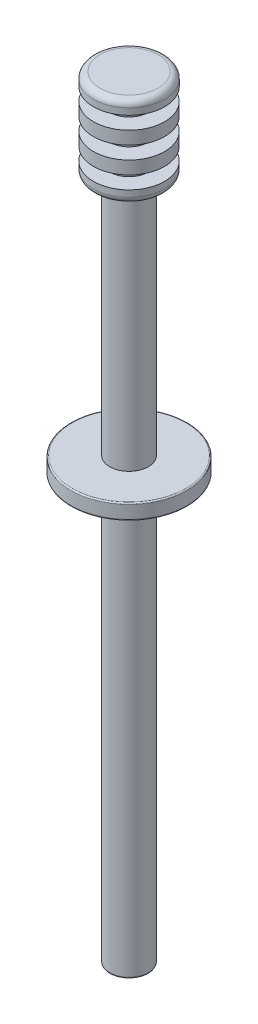
ISO-10303-21;
HEADER;
FILE_DESCRIPTION(('STEP AP214'),'2;1');
FILE_NAME('part.step','',(''),(''),'','','');
FILE_SCHEMA(('AUTOMOTIVE_DESIGN { 1 0 10303 214 1 1 1 1 }'));
ENDSEC;
DATA;
#1=APPLICATION_CONTEXT('core data for automotive mechanical design processes');
#2=APPLICATION_PROTOCOL_DEFINITION('international standard','automotive_design',2000,#1);
#3=PRODUCT_CONTEXT('',#1,'mechanical');
#4=PRODUCT('Part','Part','',(#3));
#5=PRODUCT_RELATED_PRODUCT_CATEGORY('part','',(#4));
#6=PRODUCT_DEFINITION_FORMATION('','',#4);
#7=PRODUCT_DEFINITION_CONTEXT('part definition',#1,'design');
#8=PRODUCT_DEFINITION('design','',#6,#7);
#9=PRODUCT_DEFINITION_SHAPE('','',#8);
#10=(LENGTH_UNIT() NAMED_UNIT(*) SI_UNIT(.MILLI.,.METRE.));
#11=(NAMED_UNIT(*) PLANE_ANGLE_UNIT() SI_UNIT($,.RADIAN.));
#12=(NAMED_UNIT(*) SI_UNIT($,.STERADIAN.) SOLID_ANGLE_UNIT());
#13=UNCERTAINTY_MEASURE_WITH_UNIT(LENGTH_MEASURE(1.E-05),#10,'distance_accuracy_value','');
#14=(GEOMETRIC_REPRESENTATION_CONTEXT(3) GLOBAL_UNCERTAINTY_ASSIGNED_CONTEXT((#13)) GLOBAL_UNIT_ASSIGNED_CONTEXT((#10,
#11,#12)) REPRESENTATION_CONTEXT('',''));
#15=CARTESIAN_POINT('',(0.,0.,0.));
#16=DIRECTION('',(0.,0.,1.));
#17=DIRECTION('',(1.,0.,0.));
#18=AXIS2_PLACEMENT_3D('',#15,#16,#17);
#19=CARTESIAN_POINT('',(0.,1.,0.));
#20=DIRECTION('',(0.,-1.,0.));
#21=DIRECTION('',(0.,0.,-1.));
#22=AXIS2_PLACEMENT_3D('',#19,#20,#21);
#23=CYLINDRICAL_SURFACE('',#22,2.75);
#24=CARTESIAN_POINT('',(0.,0.5,0.));
#25=DIRECTION('',(0.,1.,0.));
#26=DIRECTION('',(0.,0.,1.));
#27=AXIS2_PLACEMENT_3D('',#24,#25,#26);
#28=CIRCLE('',#27,2.75);
#29=CARTESIAN_POINT('',(0.,0.5,2.75));
#30=VERTEX_POINT('',#29);
#31=EDGE_CURVE('E80',#30,#30,#28,.F.);
#32=ORIENTED_EDGE('',*,*,#31,.T.);
#33=EDGE_LOOP('',(#32));
#34=FACE_BOUND('',#33,.T.);
#35=CARTESIAN_POINT('',(0.,0.,0.));
#36=DIRECTION('',(0.,1.,0.));
#37=DIRECTION('',(0.,0.,1.));
#38=AXIS2_PLACEMENT_3D('',#35,#36,#37);
#39=CIRCLE('',#38,2.75);
#40=CARTESIAN_POINT('',(0.,0.,2.75));
#41=VERTEX_POINT('',#40);
#42=EDGE_CURVE('E89',#41,#41,#39,.T.);
#43=ORIENTED_EDGE('',*,*,#42,.T.);
#44=EDGE_LOOP('',(#43));
#45=FACE_BOUND('',#44,.T.);
#46=ADVANCED_FACE('F40',(#34,#45),#23,.T.);
#47=CARTESIAN_POINT('',(0.,1.,0.));
#48=DIRECTION('',(0.,1.,0.));
#49=DIRECTION('',(0.,0.,1.));
#50=AXIS2_PLACEMENT_3D('',#47,#48,#49);
#51=PLANE('',#50);
#52=CARTESIAN_POINT('',(0.,1.,0.));
#53=DIRECTION('',(0.,1.,0.));
#54=DIRECTION('',(0.,0.,1.));
#55=AXIS2_PLACEMENT_3D('',#52,#53,#54);
#56=CIRCLE('',#55,2.25);
#57=CARTESIAN_POINT('',(0.,1.,2.25));
#58=VERTEX_POINT('',#57);
#59=EDGE_CURVE('E84',#58,#58,#56,.T.);
#60=ORIENTED_EDGE('',*,*,#59,.T.);
#61=EDGE_LOOP('',(#60));
#62=FACE_BOUND('',#61,.T.);
#63=ADVANCED_FACE('F168',(#62),#51,.T.);
#64=CARTESIAN_POINT('',(0.,0.,0.));
#65=DIRECTION('',(0.,1.,0.));
#66=DIRECTION('',(0.,0.,1.));
#67=AXIS2_PLACEMENT_3D('',#64,#65,#66);
#68=PLANE('',#67);
#69=CARTESIAN_POINT('',(0.,0.,0.));
#70=DIRECTION('',(0.,-1.,0.));
#71=DIRECTION('',(0.,0.,-1.));
#72=AXIS2_PLACEMENT_3D('',#69,#70,#71);
#73=CIRCLE('',#72,1.5);
#74=CARTESIAN_POINT('',(0.,0.,-1.5));
#75=VERTEX_POINT('',#74);
#76=EDGE_CURVE('E93',#75,#75,#73,.T.);
#77=ORIENTED_EDGE('',*,*,#76,.F.);
#78=EDGE_LOOP('',(#77));
#79=FACE_BOUND('',#78,.T.);
#80=ORIENTED_EDGE('',*,*,#42,.F.);
#81=EDGE_LOOP('',(#80));
#82=FACE_BOUND('',#81,.T.);
#83=ADVANCED_FACE('F174',(#79,#82),#68,.F.);
#84=CARTESIAN_POINT('',(0.,-1.,0.));
#85=DIRECTION('',(0.,1.,0.));
#86=DIRECTION('',(0.,0.,1.));
#87=AXIS2_PLACEMENT_3D('',#84,#85,#86);
#88=CYLINDRICAL_SURFACE('',#87,1.5);
#89=CARTESIAN_POINT('',(0.,-1.,0.));
#90=DIRECTION('',(0.,-1.,0.));
#91=DIRECTION('',(0.,0.,-1.));
#92=AXIS2_PLACEMENT_3D('',#89,#90,#91);
#93=CIRCLE('',#92,1.5);
#94=CARTESIAN_POINT('',(0.,-1.,-1.5));
#95=VERTEX_POINT('',#94);
#96=EDGE_CURVE('E94',#95,#95,#93,.T.);
#97=ORIENTED_EDGE('',*,*,#96,.F.);
#98=EDGE_LOOP('',(#97));
#99=FACE_BOUND('',#98,.T.);
#100=ORIENTED_EDGE('',*,*,#76,.T.);
#101=EDGE_LOOP('',(#100));
#102=FACE_BOUND('',#101,.T.);
#103=ADVANCED_FACE('F255',(#99,#102),#88,.T.);
#104=CARTESIAN_POINT('',(0.,-2.,0.));
#105=DIRECTION('',(0.,1.,0.));
#106=DIRECTION('',(0.,0.,1.));
#107=AXIS2_PLACEMENT_3D('',#104,#105,#106);
#108=CYLINDRICAL_SURFACE('',#107,2.75);
#109=CARTESIAN_POINT('',(0.,-2.,0.));
#110=DIRECTION('',(0.,-1.,0.));
#111=DIRECTION('',(0.,0.,-1.));
#112=AXIS2_PLACEMENT_3D('',#109,#110,#111);
#113=CIRCLE('',#112,2.75);
#114=CARTESIAN_POINT('',(0.,-2.,-2.75));
#115=VERTEX_POINT('',#114);
#116=EDGE_CURVE('E102',#115,#115,#113,.T.);
#117=ORIENTED_EDGE('',*,*,#116,.F.);
#118=EDGE_LOOP('',(#117));
#119=FACE_BOUND('',#118,.T.);
#120=CARTESIAN_POINT('',(0.,-1.,0.));
#121=DIRECTION('',(0.,-1.,0.));
#122=DIRECTION('',(0.,0.,-1.));
#123=AXIS2_PLACEMENT_3D('',#120,#121,#122);
#124=CIRCLE('',#123,2.75);
#125=CARTESIAN_POINT('',(0.,-1.,-2.75));
#126=VERTEX_POINT('',#125);
#127=EDGE_CURVE('E103',#126,#126,#124,.T.);
#128=ORIENTED_EDGE('',*,*,#127,.T.);
#129=EDGE_LOOP('',(#128));
#130=FACE_BOUND('',#129,.T.);
#131=ADVANCED_FACE('F248',(#119,#130),#108,.T.);
#132=CARTESIAN_POINT('',(0.,-2.,0.));
#133=DIRECTION('',(0.,-1.,0.));
#134=DIRECTION('',(0.,0.,-1.));
#135=AXIS2_PLACEMENT_3D('',#132,#133,#134);
#136=PLANE('',#135);
#137=CARTESIAN_POINT('',(0.,-2.,0.));
#138=DIRECTION('',(0.,-1.,0.));
#139=DIRECTION('',(0.,0.,-1.));
#140=AXIS2_PLACEMENT_3D('',#137,#138,#139);
#141=CIRCLE('',#140,1.5);
#142=CARTESIAN_POINT('',(0.,-2.,-1.5));
#143=VERTEX_POINT('',#142);
#144=EDGE_CURVE('E98',#143,#143,#141,.T.);
#145=ORIENTED_EDGE('',*,*,#144,.F.);
#146=EDGE_LOOP('',(#145));
#147=FACE_BOUND('',#146,.T.);
#148=ORIENTED_EDGE('',*,*,#116,.T.);
#149=EDGE_LOOP('',(#148));
#150=FACE_BOUND('',#149,.T.);
#151=ADVANCED_FACE('F245',(#147,#150),#136,.T.);
#152=CARTESIAN_POINT('',(0.,-1.,0.));
#153=DIRECTION('',(0.,-1.,0.));
#154=DIRECTION('',(0.,0.,-1.));
#155=AXIS2_PLACEMENT_3D('',#152,#153,#154);
#156=PLANE('',#155);
#157=ORIENTED_EDGE('',*,*,#96,.T.);
#158=EDGE_LOOP('',(#157));
#159=FACE_BOUND('',#158,.T.);
#160=ORIENTED_EDGE('',*,*,#127,.F.);
#161=EDGE_LOOP('',(#160));
#162=FACE_BOUND('',#161,.T.);
#163=ADVANCED_FACE('F243',(#159,#162),#156,.F.);
#164=CARTESIAN_POINT('',(0.,-3.,0.));
#165=DIRECTION('',(0.,1.,0.));
#166=DIRECTION('',(0.,0.,1.));
#167=AXIS2_PLACEMENT_3D('',#164,#165,#166);
#168=CYLINDRICAL_SURFACE('',#167,1.5);
#169=CARTESIAN_POINT('',(0.,-3.,0.));
#170=DIRECTION('',(0.,-1.,0.));
#171=DIRECTION('',(0.,0.,-1.));
#172=AXIS2_PLACEMENT_3D('',#169,#170,#171);
#173=CIRCLE('',#172,1.5);
#174=CARTESIAN_POINT('',(0.,-3.,-1.5));
#175=VERTEX_POINT('',#174);
#176=EDGE_CURVE('E107',#175,#175,#173,.T.);
#177=ORIENTED_EDGE('',*,*,#176,.F.);
#178=EDGE_LOOP('',(#177));
#179=FACE_BOUND('',#178,.T.);
#180=ORIENTED_EDGE('',*,*,#144,.T.);
#181=EDGE_LOOP('',(#180));
#182=FACE_BOUND('',#181,.T.);
#183=ADVANCED_FACE('F239',(#179,#182),#168,.T.);
#184=CARTESIAN_POINT('',(0.,-4.,0.));
#185=DIRECTION('',(0.,1.,0.));
#186=DIRECTION('',(0.,0.,1.));
#187=AXIS2_PLACEMENT_3D('',#184,#185,#186);
#188=CYLINDRICAL_SURFACE('',#187,2.75);
#189=CARTESIAN_POINT('',(0.,-4.,0.));
#190=DIRECTION('',(0.,-1.,0.));
#191=DIRECTION('',(0.,0.,-1.));
#192=AXIS2_PLACEMENT_3D('',#189,#190,#191);
#193=CIRCLE('',#192,2.75);
#194=CARTESIAN_POINT('',(0.,-4.,-2.75));
#195=VERTEX_POINT('',#194);
#196=EDGE_CURVE('E118',#195,#195,#193,.T.);
#197=ORIENTED_EDGE('',*,*,#196,.F.);
#198=EDGE_LOOP('',(#197));
#199=FACE_BOUND('',#198,.T.);
#200=CARTESIAN_POINT('',(0.,-3.,0.));
#201=DIRECTION('',(0.,-1.,0.));
#202=DIRECTION('',(0.,0.,-1.));
#203=AXIS2_PLACEMENT_3D('',#200,#201,#202);
#204=CIRCLE('',#203,2.75);
#205=CARTESIAN_POINT('',(0.,-3.,-2.75));
#206=VERTEX_POINT('',#205);
#207=EDGE_CURVE('E119',#206,#206,#204,.T.);
#208=ORIENTED_EDGE('',*,*,#207,.T.);
#209=EDGE_LOOP('',(#208));
#210=FACE_BOUND('',#209,.T.);
#211=ADVANCED_FACE('F232',(#199,#210),#188,.T.);
#212=CARTESIAN_POINT('',(0.,-4.,0.));
#213=DIRECTION('',(0.,-1.,0.));
#214=DIRECTION('',(0.,0.,-1.));
#215=AXIS2_PLACEMENT_3D('',#212,#213,#214);
#216=PLANE('',#215);
#217=CARTESIAN_POINT('',(0.,-4.,0.));
#218=DIRECTION('',(0.,-1.,0.));
#219=DIRECTION('',(0.,0.,-1.));
#220=AXIS2_PLACEMENT_3D('',#217,#218,#219);
#221=CIRCLE('',#220,1.5);
#222=CARTESIAN_POINT('',(0.,-4.,-1.5));
#223=VERTEX_POINT('',#222);
#224=EDGE_CURVE('E114',#223,#223,#221,.T.);
#225=ORIENTED_EDGE('',*,*,#224,.F.);
#226=EDGE_LOOP('',(#225));
#227=FACE_BOUND('',#226,.T.);
#228=ORIENTED_EDGE('',*,*,#196,.T.);
#229=EDGE_LOOP('',(#228));
#230=FACE_BOUND('',#229,.T.);
#231=ADVANCED_FACE('F229',(#227,#230),#216,.T.);
#232=CARTESIAN_POINT('',(0.,-3.,0.));
#233=DIRECTION('',(0.,-1.,0.));
#234=DIRECTION('',(0.,0.,-1.));
#235=AXIS2_PLACEMENT_3D('',#232,#233,#234);
#236=PLANE('',#235);
#237=ORIENTED_EDGE('',*,*,#176,.T.);
#238=EDGE_LOOP('',(#237));
#239=FACE_BOUND('',#238,.T.);
#240=ORIENTED_EDGE('',*,*,#207,.F.);
#241=EDGE_LOOP('',(#240));
#242=FACE_BOUND('',#241,.T.);
#243=ADVANCED_FACE('F227',(#239,#242),#236,.F.);
#244=CARTESIAN_POINT('',(0.,-5.,0.));
#245=DIRECTION('',(0.,1.,0.));
#246=DIRECTION('',(0.,0.,1.));
#247=AXIS2_PLACEMENT_3D('',#244,#245,#246);
#248=CYLINDRICAL_SURFACE('',#247,1.5);
#249=CARTESIAN_POINT('',(0.,-5.,0.));
#250=DIRECTION('',(0.,-1.,0.));
#251=DIRECTION('',(0.,0.,-1.));
#252=AXIS2_PLACEMENT_3D('',#249,#250,#251);
#253=CIRCLE('',#252,1.5);
#254=CARTESIAN_POINT('',(0.,-5.,-1.5));
#255=VERTEX_POINT('',#254);
#256=EDGE_CURVE('E123',#255,#255,#253,.T.);
#257=ORIENTED_EDGE('',*,*,#256,.F.);
#258=EDGE_LOOP('',(#257));
#259=FACE_BOUND('',#258,.T.);
#260=ORIENTED_EDGE('',*,*,#224,.T.);
#261=EDGE_LOOP('',(#260));
#262=FACE_BOUND('',#261,.T.);
#263=ADVANCED_FACE('F223',(#259,#262),#248,.T.);
#264=CARTESIAN_POINT('',(0.,-6.,0.));
#265=DIRECTION('',(0.,1.,0.));
#266=DIRECTION('',(0.,0.,1.));
#267=AXIS2_PLACEMENT_3D('',#264,#265,#266);
#268=CYLINDRICAL_SURFACE('',#267,2.75);
#269=CARTESIAN_POINT('',(0.,-5.5,0.));
#270=DIRECTION('',(0.,-1.,0.));
#271=DIRECTION('',(0.,0.,-1.));
#272=AXIS2_PLACEMENT_3D('',#269,#270,#271);
#273=CIRCLE('',#272,2.75);
#274=CARTESIAN_POINT('',(0.,-5.5,-2.75));
#275=VERTEX_POINT('',#274);
#276=EDGE_CURVE('E53',#275,#275,#273,.F.);
#277=ORIENTED_EDGE('',*,*,#276,.T.);
#278=EDGE_LOOP('',(#277));
#279=FACE_BOUND('',#278,.T.);
#280=CARTESIAN_POINT('',(0.,-5.,0.));
#281=DIRECTION('',(0.,-1.,0.));
#282=DIRECTION('',(0.,0.,-1.));
#283=AXIS2_PLACEMENT_3D('',#280,#281,#282);
#284=CIRCLE('',#283,2.75);
#285=CARTESIAN_POINT('',(0.,-5.,-2.75));
#286=VERTEX_POINT('',#285);
#287=EDGE_CURVE('E134',#286,#286,#284,.T.);
#288=ORIENTED_EDGE('',*,*,#287,.T.);
#289=EDGE_LOOP('',(#288));
#290=FACE_BOUND('',#289,.T.);
#291=ADVANCED_FACE('F207',(#279,#290),#268,.T.);
#292=CARTESIAN_POINT('',(0.,-6.,0.));
#293=DIRECTION('',(0.,-1.,0.));
#294=DIRECTION('',(0.,0.,-1.));
#295=AXIS2_PLACEMENT_3D('',#292,#293,#294);
#296=PLANE('',#295);
#297=CARTESIAN_POINT('',(0.,-6.,0.));
#298=DIRECTION('',(0.,-1.,0.));
#299=DIRECTION('',(0.,0.,-1.));
#300=AXIS2_PLACEMENT_3D('',#297,#298,#299);
#301=CIRCLE('',#300,2.25);
#302=CARTESIAN_POINT('',(0.,-6.,-2.25));
#303=VERTEX_POINT('',#302);
#304=EDGE_CURVE('E58',#303,#303,#301,.T.);
#305=ORIENTED_EDGE('',*,*,#304,.T.);
#306=EDGE_LOOP('',(#305));
#307=FACE_BOUND('',#306,.T.);
#308=CARTESIAN_POINT('',(0.,-6.,0.));
#309=DIRECTION('',(0.,-1.,0.));
#310=DIRECTION('',(0.,0.,-1.));
#311=AXIS2_PLACEMENT_3D('',#308,#309,#310);
#312=CIRCLE('',#311,1.5);
#313=CARTESIAN_POINT('',(0.,-6.,-1.5));
#314=VERTEX_POINT('',#313);
#315=EDGE_CURVE('E130',#314,#314,#312,.T.);
#316=ORIENTED_EDGE('',*,*,#315,.F.);
#317=EDGE_LOOP('',(#316));
#318=FACE_BOUND('',#317,.T.);
#319=ADVANCED_FACE('F203',(#307,#318),#296,.T.);
#320=CARTESIAN_POINT('',(0.,-5.,0.));
#321=DIRECTION('',(0.,-1.,0.));
#322=DIRECTION('',(0.,0.,-1.));
#323=AXIS2_PLACEMENT_3D('',#320,#321,#322);
#324=PLANE('',#323);
#325=ORIENTED_EDGE('',*,*,#256,.T.);
#326=EDGE_LOOP('',(#325));
#327=FACE_BOUND('',#326,.T.);
#328=ORIENTED_EDGE('',*,*,#287,.F.);
#329=EDGE_LOOP('',(#328));
#330=FACE_BOUND('',#329,.T.);
#331=ADVANCED_FACE('F206',(#327,#330),#324,.F.);
#332=CARTESIAN_POINT('',(0.,-24.75,0.));
#333=DIRECTION('',(0.,1.,0.));
#334=DIRECTION('',(0.,0.,1.));
#335=AXIS2_PLACEMENT_3D('',#332,#333,#334);
#336=CYLINDRICAL_SURFACE('',#335,1.5);
#337=CARTESIAN_POINT('',(0.,-24.75,0.));
#338=DIRECTION('',(0.,-1.,0.));
#339=DIRECTION('',(0.,0.,-1.));
#340=AXIS2_PLACEMENT_3D('',#337,#338,#339);
#341=CIRCLE('',#340,1.5);
#342=CARTESIAN_POINT('',(0.,-24.75,-1.5));
#343=VERTEX_POINT('',#342);
#344=EDGE_CURVE('E138',#343,#343,#341,.T.);
#345=ORIENTED_EDGE('',*,*,#344,.F.);
#346=EDGE_LOOP('',(#345));
#347=FACE_BOUND('',#346,.T.);
#348=ORIENTED_EDGE('',*,*,#315,.T.);
#349=EDGE_LOOP('',(#348));
#350=FACE_BOUND('',#349,.T.);
#351=ADVANCED_FACE('F163',(#347,#350),#336,.T.);
#352=CARTESIAN_POINT('',(0.,-25.95,0.));
#353=DIRECTION('',(0.,1.,0.));
#354=DIRECTION('',(0.,0.,1.));
#355=AXIS2_PLACEMENT_3D('',#352,#353,#354);
#356=CYLINDRICAL_SURFACE('',#355,4.5);
#357=CARTESIAN_POINT('',(0.,-24.85,0.));
#358=DIRECTION('',(0.,-1.,0.));
#359=DIRECTION('',(0.,0.,-1.));
#360=AXIS2_PLACEMENT_3D('',#357,#358,#359);
#361=CIRCLE('',#360,4.5);
#362=CARTESIAN_POINT('',(0.,-24.85,-4.5));
#363=VERTEX_POINT('',#362);
#364=EDGE_CURVE('E72',#363,#363,#361,.T.);
#365=ORIENTED_EDGE('',*,*,#364,.T.);
#366=EDGE_LOOP('',(#365));
#367=FACE_BOUND('',#366,.T.);
#368=CARTESIAN_POINT('',(0.,-25.85,0.));
#369=DIRECTION('',(0.,-1.,0.));
#370=DIRECTION('',(0.,0.,-1.));
#371=AXIS2_PLACEMENT_3D('',#368,#369,#370);
#372=CIRCLE('',#371,4.5);
#373=CARTESIAN_POINT('',(0.,-25.85,-4.5));
#374=VERTEX_POINT('',#373);
#375=EDGE_CURVE('E76',#374,#374,#372,.F.);
#376=ORIENTED_EDGE('',*,*,#375,.T.);
#377=EDGE_LOOP('',(#376));
#378=FACE_BOUND('',#377,.T.);
#379=ADVANCED_FACE('F154',(#367,#378),#356,.T.);
#380=CARTESIAN_POINT('',(0.,-25.95,0.));
#381=DIRECTION('',(0.,-1.,0.));
#382=DIRECTION('',(0.,0.,-1.));
#383=AXIS2_PLACEMENT_3D('',#380,#381,#382);
#384=PLANE('',#383);
#385=CARTESIAN_POINT('',(0.,-25.95,0.));
#386=DIRECTION('',(0.,-1.,0.));
#387=DIRECTION('',(0.,0.,-1.));
#388=AXIS2_PLACEMENT_3D('',#385,#386,#387);
#389=CIRCLE('',#388,4.4);
#390=CARTESIAN_POINT('',(0.,-25.95,-4.4));
#391=VERTEX_POINT('',#390);
#392=EDGE_CURVE('E64',#391,#391,#389,.T.);
#393=ORIENTED_EDGE('',*,*,#392,.T.);
#394=EDGE_LOOP('',(#393));
#395=FACE_BOUND('',#394,.T.);
#396=CARTESIAN_POINT('',(0.,-25.95,0.));
#397=DIRECTION('',(0.,-1.,0.));
#398=DIRECTION('',(0.,0.,-1.));
#399=AXIS2_PLACEMENT_3D('',#396,#397,#398);
#400=CIRCLE('',#399,1.5);
#401=CARTESIAN_POINT('',(0.,-25.95,-1.5));
#402=VERTEX_POINT('',#401);
#403=EDGE_CURVE('E88',#402,#402,#400,.T.);
#404=ORIENTED_EDGE('',*,*,#403,.F.);
#405=EDGE_LOOP('',(#404));
#406=FACE_BOUND('',#405,.T.);
#407=ADVANCED_FACE('F151',(#395,#406),#384,.T.);
#408=CARTESIAN_POINT('',(0.,-24.75,0.));
#409=DIRECTION('',(0.,-1.,0.));
#410=DIRECTION('',(0.,0.,-1.));
#411=AXIS2_PLACEMENT_3D('',#408,#409,#410);
#412=PLANE('',#411);
#413=CARTESIAN_POINT('',(0.,-24.75,0.));
#414=DIRECTION('',(0.,-1.,0.));
#415=DIRECTION('',(0.,0.,-1.));
#416=AXIS2_PLACEMENT_3D('',#413,#414,#415);
#417=CIRCLE('',#416,4.4);
#418=CARTESIAN_POINT('',(0.,-24.75,-4.4));
#419=VERTEX_POINT('',#418);
#420=EDGE_CURVE('E68',#419,#419,#417,.F.);
#421=ORIENTED_EDGE('',*,*,#420,.T.);
#422=EDGE_LOOP('',(#421));
#423=FACE_BOUND('',#422,.T.);
#424=ORIENTED_EDGE('',*,*,#344,.T.);
#425=EDGE_LOOP('',(#424));
#426=FACE_BOUND('',#425,.T.);
#427=ADVANCED_FACE('F153',(#423,#426),#412,.F.);
#428=CARTESIAN_POINT('',(0.,-58.76,0.));
#429=DIRECTION('',(0.,1.,0.));
#430=DIRECTION('',(0.,0.,1.));
#431=AXIS2_PLACEMENT_3D('',#428,#429,#430);
#432=CYLINDRICAL_SURFACE('',#431,1.5);
#433=CARTESIAN_POINT('',(0.,-58.66,0.));
#434=DIRECTION('',(0.,-1.,0.));
#435=DIRECTION('',(0.,0.,-1.));
#436=AXIS2_PLACEMENT_3D('',#433,#434,#435);
#437=CIRCLE('',#436,1.5);
#438=CARTESIAN_POINT('',(0.,-58.66,-1.5));
#439=VERTEX_POINT('',#438);
#440=EDGE_CURVE('E10',#439,#439,#437,.F.);
#441=ORIENTED_EDGE('',*,*,#440,.T.);
#442=EDGE_LOOP('',(#441));
#443=FACE_BOUND('',#442,.T.);
#444=ORIENTED_EDGE('',*,*,#403,.T.);
#445=EDGE_LOOP('',(#444));
#446=FACE_BOUND('',#445,.T.);
#447=ADVANCED_FACE('F149',(#443,#446),#432,.T.);
#448=CARTESIAN_POINT('',(0.,-58.76,0.));
#449=DIRECTION('',(0.,-1.,0.));
#450=DIRECTION('',(0.,0.,-1.));
#451=AXIS2_PLACEMENT_3D('',#448,#449,#450);
#452=PLANE('',#451);
#453=CARTESIAN_POINT('',(0.,-58.76,0.));
#454=DIRECTION('',(0.,-1.,0.));
#455=DIRECTION('',(0.,0.,-1.));
#456=AXIS2_PLACEMENT_3D('',#453,#454,#455);
#457=CIRCLE('',#456,1.4);
#458=CARTESIAN_POINT('',(0.,-58.76,-1.4));
#459=VERTEX_POINT('',#458);
#460=EDGE_CURVE('E48',#459,#459,#457,.T.);
#461=ORIENTED_EDGE('',*,*,#460,.T.);
#462=EDGE_LOOP('',(#461));
#463=FACE_BOUND('',#462,.T.);
#464=ADVANCED_FACE('F184',(#463),#452,.T.);
#465=CARTESIAN_POINT('',(0.,0.5,0.));
#466=DIRECTION('',(0.,1.,0.));
#467=DIRECTION('',(0.,0.,1.));
#468=AXIS2_PLACEMENT_3D('',#465,#466,#467);
#469=TOROIDAL_SURFACE('',#468,2.25,0.5);
#470=ORIENTED_EDGE('',*,*,#31,.F.);
#471=EDGE_LOOP('',(#470));
#472=FACE_BOUND('',#471,.T.);
#473=ORIENTED_EDGE('',*,*,#59,.F.);
#474=EDGE_LOOP('',(#473));
#475=FACE_BOUND('',#474,.T.);
#476=ADVANCED_FACE('F180',(#472,#475),#469,.T.);
#477=CARTESIAN_POINT('',(0.,-24.85,0.));
#478=DIRECTION('',(0.,-1.,0.));
#479=DIRECTION('',(0.,0.,-1.));
#480=AXIS2_PLACEMENT_3D('',#477,#478,#479);
#481=TOROIDAL_SURFACE('',#480,4.4,0.1);
#482=ORIENTED_EDGE('',*,*,#420,.F.);
#483=EDGE_LOOP('',(#482));
#484=FACE_BOUND('',#483,.T.);
#485=ORIENTED_EDGE('',*,*,#364,.F.);
#486=EDGE_LOOP('',(#485));
#487=FACE_BOUND('',#486,.T.);
#488=ADVANCED_FACE('F183',(#484,#487),#481,.T.);
#489=CARTESIAN_POINT('',(0.,-25.85,0.));
#490=DIRECTION('',(0.,-1.,0.));
#491=DIRECTION('',(0.,0.,-1.));
#492=AXIS2_PLACEMENT_3D('',#489,#490,#491);
#493=TOROIDAL_SURFACE('',#492,4.4,0.1);
#494=ORIENTED_EDGE('',*,*,#375,.F.);
#495=EDGE_LOOP('',(#494));
#496=FACE_BOUND('',#495,.T.);
#497=ORIENTED_EDGE('',*,*,#392,.F.);
#498=EDGE_LOOP('',(#497));
#499=FACE_BOUND('',#498,.T.);
#500=ADVANCED_FACE('F188',(#496,#499),#493,.T.);
#501=CARTESIAN_POINT('',(0.,-5.5,0.));
#502=DIRECTION('',(0.,-1.,0.));
#503=DIRECTION('',(0.,0.,-1.));
#504=AXIS2_PLACEMENT_3D('',#501,#502,#503);
#505=TOROIDAL_SURFACE('',#504,2.25,0.5);
#506=ORIENTED_EDGE('',*,*,#276,.F.);
#507=EDGE_LOOP('',(#506));
#508=FACE_BOUND('',#507,.T.);
#509=ORIENTED_EDGE('',*,*,#304,.F.);
#510=EDGE_LOOP('',(#509));
#511=FACE_BOUND('',#510,.T.);
#512=ADVANCED_FACE('F191',(#508,#511),#505,.T.);
#513=CARTESIAN_POINT('',(0.,-58.66,0.));
#514=DIRECTION('',(0.,-1.,0.));
#515=DIRECTION('',(0.,0.,-1.));
#516=AXIS2_PLACEMENT_3D('',#513,#514,#515);
#517=TOROIDAL_SURFACE('',#516,1.4,0.1);
#518=ORIENTED_EDGE('',*,*,#440,.F.);
#519=EDGE_LOOP('',(#518));
#520=FACE_BOUND('',#519,.T.);
#521=ORIENTED_EDGE('',*,*,#460,.F.);
#522=EDGE_LOOP('',(#521));
#523=FACE_BOUND('',#522,.T.);
#524=ADVANCED_FACE('F42',(#520,#523),#517,.T.);
#525=CLOSED_SHELL('',(#46,#63,#83,#103,#131,#151,#163,#183,#211,#231,#243,#263,#291,#319,#331,
#351,#379,#407,#427,#447,#464,#476,#488,#500,#512,#524));
#526=MANIFOLD_SOLID_BREP('B2',#525);
#527=ADVANCED_BREP_SHAPE_REPRESENTATION('',(#18,#526),#14);
#528=SHAPE_DEFINITION_REPRESENTATION(#9,#527);
ENDSEC;
END-ISO-10303-21;
